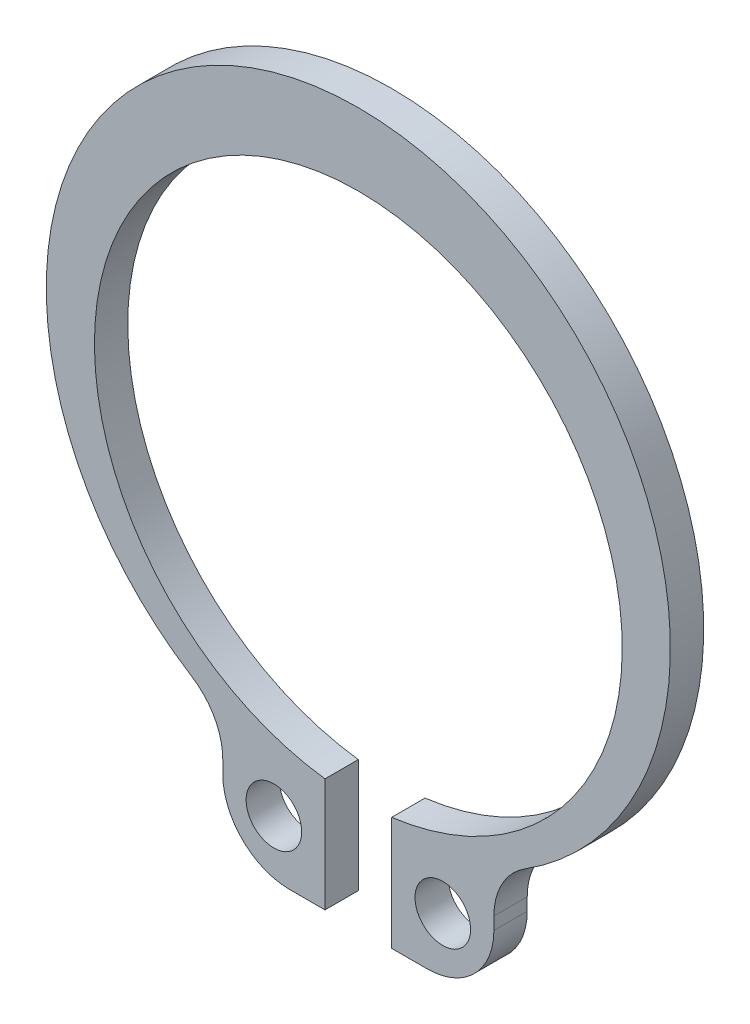
ISO-10303-21;
HEADER;
FILE_DESCRIPTION(('STEP AP214'),'2;1');
FILE_NAME('part.step','',(''),(''),'','','');
FILE_SCHEMA(('AUTOMOTIVE_DESIGN { 1 0 10303 214 1 1 1 1 }'));
ENDSEC;
DATA;
#1=APPLICATION_CONTEXT('core data for automotive mechanical design processes');
#2=APPLICATION_PROTOCOL_DEFINITION('international standard','automotive_design',2000,#1);
#3=PRODUCT_CONTEXT('',#1,'mechanical');
#4=PRODUCT('Part','Part','',(#3));
#5=PRODUCT_RELATED_PRODUCT_CATEGORY('part','',(#4));
#6=PRODUCT_DEFINITION_FORMATION('','',#4);
#7=PRODUCT_DEFINITION_CONTEXT('part definition',#1,'design');
#8=PRODUCT_DEFINITION('design','',#6,#7);
#9=PRODUCT_DEFINITION_SHAPE('','',#8);
#10=(LENGTH_UNIT() NAMED_UNIT(*) SI_UNIT(.MILLI.,.METRE.));
#11=(NAMED_UNIT(*) PLANE_ANGLE_UNIT() SI_UNIT($,.RADIAN.));
#12=(NAMED_UNIT(*) SI_UNIT($,.STERADIAN.) SOLID_ANGLE_UNIT());
#13=UNCERTAINTY_MEASURE_WITH_UNIT(LENGTH_MEASURE(1.E-05),#10,'distance_accuracy_value','');
#14=(GEOMETRIC_REPRESENTATION_CONTEXT(3) GLOBAL_UNCERTAINTY_ASSIGNED_CONTEXT((#13)) GLOBAL_UNIT_ASSIGNED_CONTEXT((#10,
#11,#12)) REPRESENTATION_CONTEXT('',''));
#15=CARTESIAN_POINT('',(0.,0.,0.));
#16=DIRECTION('',(0.,0.,1.));
#17=DIRECTION('',(1.,0.,0.));
#18=AXIS2_PLACEMENT_3D('',#15,#16,#17);
#19=CARTESIAN_POINT('',(-7.28010444925616,-10.6601653779889,1.2));
#20=DIRECTION('',(0.,0.,-1.));
#21=DIRECTION('',(-1.,0.,0.));
#22=AXIS2_PLACEMENT_3D('',#19,#20,#21);
#23=CYLINDRICAL_SURFACE('',#22,2.4);
#24=CARTESIAN_POINT('',(-7.28010444925616,-10.6601653779889,0.));
#25=DIRECTION('',(0.,0.,1.));
#26=DIRECTION('',(1.,0.,0.));
#27=AXIS2_PLACEMENT_3D('',#24,#25,#26);
#28=CIRCLE('',#27,2.4);
#29=CARTESIAN_POINT('',(-4.88010444925616,-10.6601653779889,0.));
#30=VERTEX_POINT('',#29);
#31=CARTESIAN_POINT('',(-5.998521269925,-8.63099201071458,0.));
#32=VERTEX_POINT('',#31);
#33=EDGE_CURVE('E124',#30,#32,#28,.T.);
#34=ORIENTED_EDGE('',*,*,#33,.F.);
#35=DIRECTION('',(0.,0.,-1.));
#36=VECTOR('',#35,1.);
#37=CARTESIAN_POINT('',(-4.88010444925616,-10.6601653779889,1.2));
#38=LINE('',#37,#36);
#39=CARTESIAN_POINT('',(-4.88010444925616,-10.6601653779889,1.2));
#40=VERTEX_POINT('',#39);
#41=EDGE_CURVE('E29',#40,#30,#38,.T.);
#42=ORIENTED_EDGE('',*,*,#41,.F.);
#43=CARTESIAN_POINT('',(-7.28010444925616,-10.6601653779889,1.2));
#44=DIRECTION('',(0.,0.,1.));
#45=DIRECTION('',(1.,0.,0.));
#46=AXIS2_PLACEMENT_3D('',#43,#44,#45);
#47=CIRCLE('',#46,2.4);
#48=CARTESIAN_POINT('',(-5.998521269925,-8.63099201071458,1.2));
#49=VERTEX_POINT('',#48);
#50=EDGE_CURVE('E154',#40,#49,#47,.T.);
#51=ORIENTED_EDGE('',*,*,#50,.T.);
#52=DIRECTION('',(0.,0.,-1.));
#53=VECTOR('',#52,1.);
#54=CARTESIAN_POINT('',(-5.998521269925,-8.63099201071458,1.2));
#55=LINE('',#54,#53);
#56=EDGE_CURVE('E10',#49,#32,#55,.T.);
#57=ORIENTED_EDGE('',*,*,#56,.T.);
#58=EDGE_LOOP('',(#34,#42,#51,#57));
#59=FACE_BOUND('',#58,.T.);
#60=ADVANCED_FACE('F15',(#59),#23,.F.);
#61=CARTESIAN_POINT('',(0.,0.866666666666667,1.2));
#62=DIRECTION('',(0.,0.,-1.));
#63=DIRECTION('',(-1.,0.,0.));
#64=AXIS2_PLACEMENT_3D('',#61,#62,#63);
#65=CYLINDRICAL_SURFACE('',#64,11.2333333333333);
#66=CARTESIAN_POINT('',(0.,0.866666666666667,0.));
#67=DIRECTION('',(0.,0.,1.));
#68=DIRECTION('',(1.,0.,0.));
#69=AXIS2_PLACEMENT_3D('',#66,#67,#68);
#70=CIRCLE('',#69,11.2333333333333);
#71=CARTESIAN_POINT('',(5.99852126992499,-8.63099201071458,0.));
#72=VERTEX_POINT('',#71);
#73=EDGE_CURVE('E106',#72,#32,#70,.T.);
#74=ORIENTED_EDGE('',*,*,#73,.T.);
#75=ORIENTED_EDGE('',*,*,#56,.F.);
#76=CARTESIAN_POINT('',(0.,0.866666666666667,1.2));
#77=DIRECTION('',(0.,0.,1.));
#78=DIRECTION('',(1.,0.,0.));
#79=AXIS2_PLACEMENT_3D('',#76,#77,#78);
#80=CIRCLE('',#79,11.2333333333333);
#81=CARTESIAN_POINT('',(5.99852126992499,-8.63099201071458,1.2));
#82=VERTEX_POINT('',#81);
#83=EDGE_CURVE('E109',#82,#49,#80,.T.);
#84=ORIENTED_EDGE('',*,*,#83,.F.);
#85=DIRECTION('',(0.,0.,-1.));
#86=VECTOR('',#85,1.);
#87=CARTESIAN_POINT('',(5.99852126992499,-8.63099201071458,1.2));
#88=LINE('',#87,#86);
#89=EDGE_CURVE('E18',#82,#72,#88,.T.);
#90=ORIENTED_EDGE('',*,*,#89,.T.);
#91=EDGE_LOOP('',(#74,#75,#84,#90));
#92=FACE_BOUND('',#91,.T.);
#93=ADVANCED_FACE('F104',(#92),#65,.T.);
#94=CARTESIAN_POINT('',(7.28010444925615,-10.6601653779889,1.2));
#95=DIRECTION('',(0.,0.,-1.));
#96=DIRECTION('',(-1.,0.,0.));
#97=AXIS2_PLACEMENT_3D('',#94,#95,#96);
#98=CYLINDRICAL_SURFACE('',#97,2.4);
#99=CARTESIAN_POINT('',(7.28010444925615,-10.6601653779889,0.));
#100=DIRECTION('',(0.,0.,1.));
#101=DIRECTION('',(1.,0.,0.));
#102=AXIS2_PLACEMENT_3D('',#99,#100,#101);
#103=CIRCLE('',#102,2.4);
#104=CARTESIAN_POINT('',(4.88010444925615,-10.6601653779889,0.));
#105=VERTEX_POINT('',#104);
#106=EDGE_CURVE('E115',#72,#105,#103,.T.);
#107=ORIENTED_EDGE('',*,*,#106,.F.);
#108=ORIENTED_EDGE('',*,*,#89,.F.);
#109=CARTESIAN_POINT('',(7.28010444925615,-10.6601653779889,1.2));
#110=DIRECTION('',(0.,0.,1.));
#111=DIRECTION('',(1.,0.,0.));
#112=AXIS2_PLACEMENT_3D('',#109,#110,#111);
#113=CIRCLE('',#112,2.4);
#114=CARTESIAN_POINT('',(4.88010444925615,-10.6601653779889,1.2));
#115=VERTEX_POINT('',#114);
#116=EDGE_CURVE('E157',#82,#115,#113,.T.);
#117=ORIENTED_EDGE('',*,*,#116,.T.);
#118=DIRECTION('',(0.,0.,-1.));
#119=VECTOR('',#118,1.);
#120=CARTESIAN_POINT('',(4.88010444925615,-10.6601653779889,1.2));
#121=LINE('',#120,#119);
#122=EDGE_CURVE('E113',#115,#105,#121,.T.);
#123=ORIENTED_EDGE('',*,*,#122,.T.);
#124=EDGE_LOOP('',(#107,#108,#117,#123));
#125=FACE_BOUND('',#124,.T.);
#126=ADVANCED_FACE('F116',(#125),#98,.F.);
#127=CARTESIAN_POINT('',(4.88010444925615,-11.11,1.2));
#128=DIRECTION('',(-1.,0.,0.));
#129=DIRECTION('',(0.,0.,1.));
#130=AXIS2_PLACEMENT_3D('',#127,#128,#129);
#131=PLANE('',#130);
#132=DIRECTION('',(0.,1.,0.));
#133=VECTOR('',#132,1.);
#134=CARTESIAN_POINT('',(4.88010444925615,-11.11,0.));
#135=LINE('',#134,#133);
#136=CARTESIAN_POINT('',(4.88010444925615,-11.11,0.));
#137=VERTEX_POINT('',#136);
#138=EDGE_CURVE('E120',#137,#105,#135,.T.);
#139=ORIENTED_EDGE('',*,*,#138,.T.);
#140=ORIENTED_EDGE('',*,*,#122,.F.);
#141=DIRECTION('',(0.,1.,0.));
#142=VECTOR('',#141,1.);
#143=CARTESIAN_POINT('',(4.88010444925615,-11.11,1.2));
#144=LINE('',#143,#142);
#145=CARTESIAN_POINT('',(4.88010444925615,-11.11,1.2));
#146=VERTEX_POINT('',#145);
#147=EDGE_CURVE('E159',#146,#115,#144,.T.);
#148=ORIENTED_EDGE('',*,*,#147,.F.);
#149=DIRECTION('',(0.,0.,-1.));
#150=VECTOR('',#149,1.);
#151=CARTESIAN_POINT('',(4.88010444925615,-11.11,1.2));
#152=LINE('',#151,#150);
#153=EDGE_CURVE('E201',#146,#137,#152,.T.);
#154=ORIENTED_EDGE('',*,*,#153,.T.);
#155=EDGE_LOOP('',(#139,#140,#148,#154));
#156=FACE_BOUND('',#155,.T.);
#157=ADVANCED_FACE('F205',(#156),#131,.F.);
#158=CARTESIAN_POINT('',(2.48010444925614,-11.11,1.2));
#159=DIRECTION('',(0.,0.,-1.));
#160=DIRECTION('',(-1.,0.,0.));
#161=AXIS2_PLACEMENT_3D('',#158,#159,#160);
#162=CYLINDRICAL_SURFACE('',#161,2.4);
#163=CARTESIAN_POINT('',(2.48010444925614,-11.11,0.));
#164=DIRECTION('',(0.,0.,1.));
#165=DIRECTION('',(1.,0.,0.));
#166=AXIS2_PLACEMENT_3D('',#163,#164,#165);
#167=CIRCLE('',#166,2.4);
#168=CARTESIAN_POINT('',(2.48010444925614,-13.51,0.));
#169=VERTEX_POINT('',#168);
#170=EDGE_CURVE('E132',#169,#137,#167,.T.);
#171=ORIENTED_EDGE('',*,*,#170,.T.);
#172=ORIENTED_EDGE('',*,*,#153,.F.);
#173=CARTESIAN_POINT('',(2.48010444925614,-11.11,1.2));
#174=DIRECTION('',(0.,0.,1.));
#175=DIRECTION('',(1.,0.,0.));
#176=AXIS2_PLACEMENT_3D('',#173,#174,#175);
#177=CIRCLE('',#176,2.4);
#178=CARTESIAN_POINT('',(2.48010444925614,-13.51,1.2));
#179=VERTEX_POINT('',#178);
#180=EDGE_CURVE('E162',#179,#146,#177,.T.);
#181=ORIENTED_EDGE('',*,*,#180,.F.);
#182=DIRECTION('',(0.,0.,-1.));
#183=VECTOR('',#182,1.);
#184=CARTESIAN_POINT('',(2.48010444925614,-13.51,1.2));
#185=LINE('',#184,#183);
#186=EDGE_CURVE('E199',#179,#169,#185,.T.);
#187=ORIENTED_EDGE('',*,*,#186,.T.);
#188=EDGE_LOOP('',(#171,#172,#181,#187));
#189=FACE_BOUND('',#188,.T.);
#190=ADVANCED_FACE('F209',(#189),#162,.T.);
#191=CARTESIAN_POINT('',(1.2,-13.51,1.2));
#192=DIRECTION('',(0.,1.,0.));
#193=DIRECTION('',(-1.,0.,0.));
#194=AXIS2_PLACEMENT_3D('',#191,#192,#193);
#195=PLANE('',#194);
#196=DIRECTION('',(1.,0.,0.));
#197=VECTOR('',#196,1.);
#198=CARTESIAN_POINT('',(1.2,-13.51,0.));
#199=LINE('',#198,#197);
#200=CARTESIAN_POINT('',(1.2,-13.51,0.));
#201=VERTEX_POINT('',#200);
#202=EDGE_CURVE('E135',#201,#169,#199,.T.);
#203=ORIENTED_EDGE('',*,*,#202,.T.);
#204=ORIENTED_EDGE('',*,*,#186,.F.);
#205=DIRECTION('',(1.,0.,0.));
#206=VECTOR('',#205,1.);
#207=CARTESIAN_POINT('',(1.2,-13.51,1.2));
#208=LINE('',#207,#206);
#209=CARTESIAN_POINT('',(1.2,-13.51,1.2));
#210=VERTEX_POINT('',#209);
#211=EDGE_CURVE('E165',#210,#179,#208,.T.);
#212=ORIENTED_EDGE('',*,*,#211,.F.);
#213=DIRECTION('',(0.,0.,-1.));
#214=VECTOR('',#213,1.);
#215=CARTESIAN_POINT('',(1.2,-13.51,1.2));
#216=LINE('',#215,#214);
#217=EDGE_CURVE('E197',#210,#201,#216,.T.);
#218=ORIENTED_EDGE('',*,*,#217,.T.);
#219=EDGE_LOOP('',(#203,#204,#212,#218));
#220=FACE_BOUND('',#219,.T.);
#221=ADVANCED_FACE('F213',(#220),#195,.F.);
#222=CARTESIAN_POINT('',(1.2,-13.51,1.2));
#223=DIRECTION('',(-1.,0.,0.));
#224=DIRECTION('',(0.,-1.,0.));
#225=AXIS2_PLACEMENT_3D('',#222,#223,#224);
#226=PLANE('',#225);
#227=DIRECTION('',(0.,1.,0.));
#228=VECTOR('',#227,1.);
#229=CARTESIAN_POINT('',(1.2,-13.51,0.));
#230=LINE('',#229,#228);
#231=CARTESIAN_POINT('',(1.2,-9.42390577202467,0.));
#232=VERTEX_POINT('',#231);
#233=EDGE_CURVE('E138',#201,#232,#230,.T.);
#234=ORIENTED_EDGE('',*,*,#233,.F.);
#235=ORIENTED_EDGE('',*,*,#217,.F.);
#236=DIRECTION('',(0.,1.,0.));
#237=VECTOR('',#236,1.);
#238=CARTESIAN_POINT('',(1.2,-13.51,1.2));
#239=LINE('',#238,#237);
#240=CARTESIAN_POINT('',(1.2,-9.42390577202467,1.2));
#241=VERTEX_POINT('',#240);
#242=EDGE_CURVE('E168',#210,#241,#239,.T.);
#243=ORIENTED_EDGE('',*,*,#242,.T.);
#244=DIRECTION('',(0.,0.,-1.));
#245=VECTOR('',#244,1.);
#246=CARTESIAN_POINT('',(1.2,-9.42390577202467,1.2));
#247=LINE('',#246,#245);
#248=EDGE_CURVE('E195',#241,#232,#247,.T.);
#249=ORIENTED_EDGE('',*,*,#248,.T.);
#250=EDGE_LOOP('',(#234,#235,#243,#249));
#251=FACE_BOUND('',#250,.T.);
#252=ADVANCED_FACE('F217',(#251),#226,.T.);
#253=CARTESIAN_POINT('',(0.,0.,1.2));
#254=DIRECTION('',(0.,0.,-1.));
#255=DIRECTION('',(-1.,0.,0.));
#256=AXIS2_PLACEMENT_3D('',#253,#254,#255);
#257=CYLINDRICAL_SURFACE('',#256,9.5);
#258=CARTESIAN_POINT('',(0.,0.,0.));
#259=DIRECTION('',(0.,0.,1.));
#260=DIRECTION('',(1.,0.,0.));
#261=AXIS2_PLACEMENT_3D('',#258,#259,#260);
#262=CIRCLE('',#261,9.5);
#263=CARTESIAN_POINT('',(-1.2,-9.42390577202467,0.));
#264=VERTEX_POINT('',#263);
#265=EDGE_CURVE('E141',#232,#264,#262,.T.);
#266=ORIENTED_EDGE('',*,*,#265,.F.);
#267=ORIENTED_EDGE('',*,*,#248,.F.);
#268=CARTESIAN_POINT('',(0.,0.,1.2));
#269=DIRECTION('',(0.,0.,1.));
#270=DIRECTION('',(1.,0.,0.));
#271=AXIS2_PLACEMENT_3D('',#268,#269,#270);
#272=CIRCLE('',#271,9.5);
#273=CARTESIAN_POINT('',(-1.2,-9.42390577202467,1.2));
#274=VERTEX_POINT('',#273);
#275=EDGE_CURVE('E171',#241,#274,#272,.T.);
#276=ORIENTED_EDGE('',*,*,#275,.T.);
#277=DIRECTION('',(0.,0.,-1.));
#278=VECTOR('',#277,1.);
#279=CARTESIAN_POINT('',(-1.2,-9.42390577202467,1.2));
#280=LINE('',#279,#278);
#281=EDGE_CURVE('E193',#274,#264,#280,.T.);
#282=ORIENTED_EDGE('',*,*,#281,.T.);
#283=EDGE_LOOP('',(#266,#267,#276,#282));
#284=FACE_BOUND('',#283,.T.);
#285=ADVANCED_FACE('F221',(#284),#257,.F.);
#286=CARTESIAN_POINT('',(-1.2,-13.51,1.2));
#287=DIRECTION('',(-1.,0.,0.));
#288=DIRECTION('',(0.,-1.,0.));
#289=AXIS2_PLACEMENT_3D('',#286,#287,#288);
#290=PLANE('',#289);
#291=DIRECTION('',(0.,1.,0.));
#292=VECTOR('',#291,1.);
#293=CARTESIAN_POINT('',(-1.2,-13.51,0.));
#294=LINE('',#293,#292);
#295=CARTESIAN_POINT('',(-1.2,-13.51,0.));
#296=VERTEX_POINT('',#295);
#297=EDGE_CURVE('E144',#296,#264,#294,.T.);
#298=ORIENTED_EDGE('',*,*,#297,.T.);
#299=ORIENTED_EDGE('',*,*,#281,.F.);
#300=DIRECTION('',(0.,1.,0.));
#301=VECTOR('',#300,1.);
#302=CARTESIAN_POINT('',(-1.2,-13.51,1.2));
#303=LINE('',#302,#301);
#304=CARTESIAN_POINT('',(-1.2,-13.51,1.2));
#305=VERTEX_POINT('',#304);
#306=EDGE_CURVE('E174',#305,#274,#303,.T.);
#307=ORIENTED_EDGE('',*,*,#306,.F.);
#308=DIRECTION('',(0.,0.,-1.));
#309=VECTOR('',#308,1.);
#310=CARTESIAN_POINT('',(-1.2,-13.51,1.2));
#311=LINE('',#310,#309);
#312=EDGE_CURVE('E191',#305,#296,#311,.T.);
#313=ORIENTED_EDGE('',*,*,#312,.T.);
#314=EDGE_LOOP('',(#298,#299,#307,#313));
#315=FACE_BOUND('',#314,.T.);
#316=ADVANCED_FACE('F226',(#315),#290,.F.);
#317=CARTESIAN_POINT('',(-2.48010444925616,-13.51,1.2));
#318=DIRECTION('',(0.,1.,0.));
#319=DIRECTION('',(-1.,0.,0.));
#320=AXIS2_PLACEMENT_3D('',#317,#318,#319);
#321=PLANE('',#320);
#322=DIRECTION('',(1.,0.,0.));
#323=VECTOR('',#322,1.);
#324=CARTESIAN_POINT('',(-2.48010444925616,-13.51,0.));
#325=LINE('',#324,#323);
#326=CARTESIAN_POINT('',(-2.48010444925616,-13.51,0.));
#327=VERTEX_POINT('',#326);
#328=EDGE_CURVE('E147',#327,#296,#325,.T.);
#329=ORIENTED_EDGE('',*,*,#328,.T.);
#330=ORIENTED_EDGE('',*,*,#312,.F.);
#331=DIRECTION('',(1.,0.,0.));
#332=VECTOR('',#331,1.);
#333=CARTESIAN_POINT('',(-2.48010444925616,-13.51,1.2));
#334=LINE('',#333,#332);
#335=CARTESIAN_POINT('',(-2.48010444925616,-13.51,1.2));
#336=VERTEX_POINT('',#335);
#337=EDGE_CURVE('E177',#336,#305,#334,.T.);
#338=ORIENTED_EDGE('',*,*,#337,.F.);
#339=DIRECTION('',(0.,0.,-1.));
#340=VECTOR('',#339,1.);
#341=CARTESIAN_POINT('',(-2.48010444925616,-13.51,1.2));
#342=LINE('',#341,#340);
#343=EDGE_CURVE('E189',#336,#327,#342,.T.);
#344=ORIENTED_EDGE('',*,*,#343,.T.);
#345=EDGE_LOOP('',(#329,#330,#338,#344));
#346=FACE_BOUND('',#345,.T.);
#347=ADVANCED_FACE('F230',(#346),#321,.F.);
#348=CARTESIAN_POINT('',(-2.48010444925616,-11.11,1.2));
#349=DIRECTION('',(0.,0.,-1.));
#350=DIRECTION('',(-1.,0.,0.));
#351=AXIS2_PLACEMENT_3D('',#348,#349,#350);
#352=CYLINDRICAL_SURFACE('',#351,2.4);
#353=CARTESIAN_POINT('',(-2.48010444925616,-11.11,0.));
#354=DIRECTION('',(0.,0.,1.));
#355=DIRECTION('',(1.,0.,0.));
#356=AXIS2_PLACEMENT_3D('',#353,#354,#355);
#357=CIRCLE('',#356,2.4);
#358=CARTESIAN_POINT('',(-4.88010444925616,-11.11,0.));
#359=VERTEX_POINT('',#358);
#360=EDGE_CURVE('E150',#359,#327,#357,.T.);
#361=ORIENTED_EDGE('',*,*,#360,.T.);
#362=ORIENTED_EDGE('',*,*,#343,.F.);
#363=CARTESIAN_POINT('',(-2.48010444925616,-11.11,1.2));
#364=DIRECTION('',(0.,0.,1.));
#365=DIRECTION('',(1.,0.,0.));
#366=AXIS2_PLACEMENT_3D('',#363,#364,#365);
#367=CIRCLE('',#366,2.4);
#368=CARTESIAN_POINT('',(-4.88010444925616,-11.11,1.2));
#369=VERTEX_POINT('',#368);
#370=EDGE_CURVE('E180',#369,#336,#367,.T.);
#371=ORIENTED_EDGE('',*,*,#370,.F.);
#372=DIRECTION('',(0.,0.,-1.));
#373=VECTOR('',#372,1.);
#374=CARTESIAN_POINT('',(-4.88010444925616,-11.11,1.2));
#375=LINE('',#374,#373);
#376=EDGE_CURVE('E36',#369,#359,#375,.T.);
#377=ORIENTED_EDGE('',*,*,#376,.T.);
#378=EDGE_LOOP('',(#361,#362,#371,#377));
#379=FACE_BOUND('',#378,.T.);
#380=ADVANCED_FACE('F232',(#379),#352,.T.);
#381=CARTESIAN_POINT('',(-4.88010444925616,-10.6601653779889,1.2));
#382=DIRECTION('',(1.,0.,0.));
#383=DIRECTION('',(0.,0.,-1.));
#384=AXIS2_PLACEMENT_3D('',#381,#382,#383);
#385=PLANE('',#384);
#386=DIRECTION('',(0.,-1.,0.));
#387=VECTOR('',#386,1.);
#388=CARTESIAN_POINT('',(-4.88010444925616,-10.6601653779889,0.));
#389=LINE('',#388,#387);
#390=EDGE_CURVE('E153',#30,#359,#389,.T.);
#391=ORIENTED_EDGE('',*,*,#390,.T.);
#392=ORIENTED_EDGE('',*,*,#376,.F.);
#393=DIRECTION('',(0.,-1.,0.));
#394=VECTOR('',#393,1.);
#395=CARTESIAN_POINT('',(-4.88010444925616,-10.6601653779889,1.2));
#396=LINE('',#395,#394);
#397=EDGE_CURVE('E183',#40,#369,#396,.T.);
#398=ORIENTED_EDGE('',*,*,#397,.F.);
#399=ORIENTED_EDGE('',*,*,#41,.T.);
#400=EDGE_LOOP('',(#391,#392,#398,#399));
#401=FACE_BOUND('',#400,.T.);
#402=ADVANCED_FACE('F236',(#401),#385,.F.);
#403=CARTESIAN_POINT('',(-7.28010444925616,-10.6601653779889,1.2));
#404=DIRECTION('',(0.,0.,1.));
#405=DIRECTION('',(1.,0.,0.));
#406=AXIS2_PLACEMENT_3D('',#403,#404,#405);
#407=PLANE('',#406);
#408=CARTESIAN_POINT('',(-3.04005222462808,-11.5,1.2));
#409=DIRECTION('',(0.,0.,-1.));
#410=DIRECTION('',(0.,1.,0.));
#411=AXIS2_PLACEMENT_3D('',#408,#409,#410);
#412=CIRCLE('',#411,1.);
#413=CARTESIAN_POINT('',(-3.04005222462808,-10.5,1.2));
#414=VERTEX_POINT('',#413);
#415=EDGE_CURVE('E331',#414,#414,#412,.T.);
#416=ORIENTED_EDGE('',*,*,#415,.T.);
#417=EDGE_LOOP('',(#416));
#418=FACE_BOUND('',#417,.T.);
#419=CARTESIAN_POINT('',(3.04005222462808,-11.5,1.2));
#420=DIRECTION('',(0.,0.,-1.));
#421=DIRECTION('',(0.,1.,0.));
#422=AXIS2_PLACEMENT_3D('',#419,#420,#421);
#423=CIRCLE('',#422,1.);
#424=CARTESIAN_POINT('',(3.04005222462808,-10.5,1.2));
#425=VERTEX_POINT('',#424);
#426=EDGE_CURVE('E126',#425,#425,#423,.T.);
#427=ORIENTED_EDGE('',*,*,#426,.T.);
#428=EDGE_LOOP('',(#427));
#429=FACE_BOUND('',#428,.T.);
#430=ORIENTED_EDGE('',*,*,#50,.F.);
#431=ORIENTED_EDGE('',*,*,#397,.T.);
#432=ORIENTED_EDGE('',*,*,#370,.T.);
#433=ORIENTED_EDGE('',*,*,#337,.T.);
#434=ORIENTED_EDGE('',*,*,#306,.T.);
#435=ORIENTED_EDGE('',*,*,#275,.F.);
#436=ORIENTED_EDGE('',*,*,#242,.F.);
#437=ORIENTED_EDGE('',*,*,#211,.T.);
#438=ORIENTED_EDGE('',*,*,#180,.T.);
#439=ORIENTED_EDGE('',*,*,#147,.T.);
#440=ORIENTED_EDGE('',*,*,#116,.F.);
#441=ORIENTED_EDGE('',*,*,#83,.T.);
#442=EDGE_LOOP('',(#430,#431,#432,#433,#434,#435,#436,#437,#438,#439,#440,#441));
#443=FACE_BOUND('',#442,.T.);
#444=ADVANCED_FACE('F235',(#418,#429,#443),#407,.T.);
#445=CARTESIAN_POINT('',(-7.28010444925616,-10.6601653779889,0.));
#446=DIRECTION('',(0.,0.,1.));
#447=DIRECTION('',(1.,0.,0.));
#448=AXIS2_PLACEMENT_3D('',#445,#446,#447);
#449=PLANE('',#448);
#450=CARTESIAN_POINT('',(-3.04005222462808,-11.5,0.));
#451=DIRECTION('',(0.,0.,1.));
#452=DIRECTION('',(0.,1.,0.));
#453=AXIS2_PLACEMENT_3D('',#450,#451,#452);
#454=CIRCLE('',#453,1.);
#455=CARTESIAN_POINT('',(-3.04005222462808,-10.5,0.));
#456=VERTEX_POINT('',#455);
#457=EDGE_CURVE('E334',#456,#456,#454,.T.);
#458=ORIENTED_EDGE('',*,*,#457,.T.);
#459=EDGE_LOOP('',(#458));
#460=FACE_BOUND('',#459,.T.);
#461=CARTESIAN_POINT('',(3.04005222462808,-11.5,0.));
#462=DIRECTION('',(0.,0.,1.));
#463=DIRECTION('',(0.,1.,0.));
#464=AXIS2_PLACEMENT_3D('',#461,#462,#463);
#465=CIRCLE('',#464,1.);
#466=CARTESIAN_POINT('',(3.04005222462808,-10.5,0.));
#467=VERTEX_POINT('',#466);
#468=EDGE_CURVE('E336',#467,#467,#465,.T.);
#469=ORIENTED_EDGE('',*,*,#468,.T.);
#470=EDGE_LOOP('',(#469));
#471=FACE_BOUND('',#470,.T.);
#472=ORIENTED_EDGE('',*,*,#33,.T.);
#473=ORIENTED_EDGE('',*,*,#73,.F.);
#474=ORIENTED_EDGE('',*,*,#106,.T.);
#475=ORIENTED_EDGE('',*,*,#138,.F.);
#476=ORIENTED_EDGE('',*,*,#170,.F.);
#477=ORIENTED_EDGE('',*,*,#202,.F.);
#478=ORIENTED_EDGE('',*,*,#233,.T.);
#479=ORIENTED_EDGE('',*,*,#265,.T.);
#480=ORIENTED_EDGE('',*,*,#297,.F.);
#481=ORIENTED_EDGE('',*,*,#328,.F.);
#482=ORIENTED_EDGE('',*,*,#360,.F.);
#483=ORIENTED_EDGE('',*,*,#390,.F.);
#484=EDGE_LOOP('',(#472,#473,#474,#475,#476,#477,#478,#479,#480,#481,#482,#483));
#485=FACE_BOUND('',#484,.T.);
#486=ADVANCED_FACE('F122',(#460,#471,#485),#449,.F.);
#487=CARTESIAN_POINT('',(3.04005222462808,-11.5,0.));
#488=DIRECTION('',(0.,0.,1.));
#489=DIRECTION('',(0.,1.,0.));
#490=AXIS2_PLACEMENT_3D('',#487,#488,#489);
#491=CYLINDRICAL_SURFACE('',#490,1.);
#492=ORIENTED_EDGE('',*,*,#426,.F.);
#493=EDGE_LOOP('',(#492));
#494=FACE_BOUND('',#493,.T.);
#495=ORIENTED_EDGE('',*,*,#468,.F.);
#496=EDGE_LOOP('',(#495));
#497=FACE_BOUND('',#496,.T.);
#498=ADVANCED_FACE('F302',(#494,#497),#491,.F.);
#499=CARTESIAN_POINT('',(-3.04005222462808,-11.5,0.));
#500=DIRECTION('',(0.,0.,1.));
#501=DIRECTION('',(0.,1.,0.));
#502=AXIS2_PLACEMENT_3D('',#499,#500,#501);
#503=CYLINDRICAL_SURFACE('',#502,1.);
#504=ORIENTED_EDGE('',*,*,#415,.F.);
#505=EDGE_LOOP('',(#504));
#506=FACE_BOUND('',#505,.T.);
#507=ORIENTED_EDGE('',*,*,#457,.F.);
#508=EDGE_LOOP('',(#507));
#509=FACE_BOUND('',#508,.T.);
#510=ADVANCED_FACE('F312',(#506,#509),#503,.F.);
#511=CLOSED_SHELL('',(#60,#93,#126,#157,#190,#221,#252,#285,#316,#347,#380,#402,#444,#486,#498,#510));
#512=MANIFOLD_SOLID_BREP('B1',#511);
#513=ADVANCED_BREP_SHAPE_REPRESENTATION('',(#18,#512),#14);
#514=SHAPE_DEFINITION_REPRESENTATION(#9,#513);
ENDSEC;
END-ISO-10303-21;
